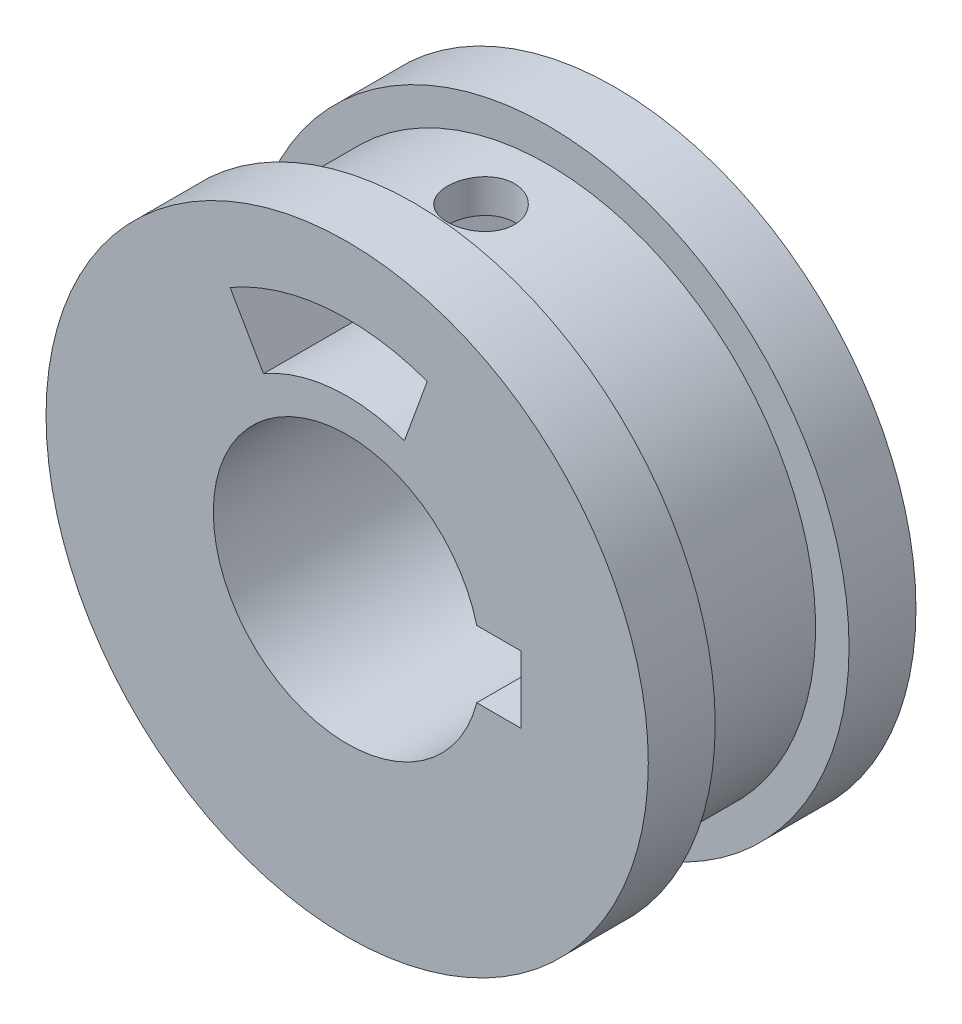
ISO-10303-21;
HEADER;
FILE_DESCRIPTION(('STEP AP214'),'2;1');
FILE_NAME('part.step','',(''),(''),'','','');
FILE_SCHEMA(('AUTOMOTIVE_DESIGN { 1 0 10303 214 1 1 1 1 }'));
ENDSEC;
DATA;
#1=APPLICATION_CONTEXT('core data for automotive mechanical design processes');
#2=APPLICATION_PROTOCOL_DEFINITION('international standard','automotive_design',2000,#1);
#3=PRODUCT_CONTEXT('',#1,'mechanical');
#4=PRODUCT('Part','Part','',(#3));
#5=PRODUCT_RELATED_PRODUCT_CATEGORY('part','',(#4));
#6=PRODUCT_DEFINITION_FORMATION('','',#4);
#7=PRODUCT_DEFINITION_CONTEXT('part definition',#1,'design');
#8=PRODUCT_DEFINITION('design','',#6,#7);
#9=PRODUCT_DEFINITION_SHAPE('','',#8);
#10=(LENGTH_UNIT() NAMED_UNIT(*) SI_UNIT(.MILLI.,.METRE.));
#11=(NAMED_UNIT(*) PLANE_ANGLE_UNIT() SI_UNIT($,.RADIAN.));
#12=(NAMED_UNIT(*) SI_UNIT($,.STERADIAN.) SOLID_ANGLE_UNIT());
#13=UNCERTAINTY_MEASURE_WITH_UNIT(LENGTH_MEASURE(1.E-05),#10,'distance_accuracy_value','');
#14=(GEOMETRIC_REPRESENTATION_CONTEXT(3) GLOBAL_UNCERTAINTY_ASSIGNED_CONTEXT((#13)) GLOBAL_UNIT_ASSIGNED_CONTEXT((#10,
#11,#12)) REPRESENTATION_CONTEXT('',''));
#15=CARTESIAN_POINT('',(0.,0.,0.));
#16=DIRECTION('',(0.,0.,1.));
#17=DIRECTION('',(1.,0.,0.));
#18=AXIS2_PLACEMENT_3D('',#15,#16,#17);
#19=CARTESIAN_POINT('',(0.,0.,5.));
#20=DIRECTION('',(0.,0.,-1.));
#21=DIRECTION('',(-1.,0.,0.));
#22=AXIS2_PLACEMENT_3D('',#19,#20,#21);
#23=PLANE('',#22);
#24=CARTESIAN_POINT('',(0.,0.,5.));
#25=DIRECTION('',(0.,0.,-1.));
#26=DIRECTION('',(-1.,0.,0.));
#27=AXIS2_PLACEMENT_3D('',#24,#25,#26);
#28=CIRCLE('',#27,20.);
#29=CARTESIAN_POINT('',(-20.,0.,5.));
#30=VERTEX_POINT('',#29);
#31=EDGE_CURVE('E20',#30,#30,#28,.F.);
#32=ORIENTED_EDGE('',*,*,#31,.F.);
#33=EDGE_LOOP('',(#32));
#34=FACE_BOUND('',#33,.T.);
#35=CARTESIAN_POINT('',(0.,0.,5.));
#36=DIRECTION('',(0.,0.,-1.));
#37=DIRECTION('',(-1.,0.,0.));
#38=AXIS2_PLACEMENT_3D('',#35,#36,#37);
#39=CIRCLE('',#38,22.5);
#40=CARTESIAN_POINT('',(-22.5,0.,5.));
#41=VERTEX_POINT('',#40);
#42=EDGE_CURVE('E254',#41,#41,#39,.T.);
#43=ORIENTED_EDGE('',*,*,#42,.F.);
#44=EDGE_LOOP('',(#43));
#45=FACE_BOUND('',#44,.T.);
#46=ADVANCED_FACE('F17',(#34,#45),#23,.F.);
#47=CARTESIAN_POINT('',(0.,0.,20.));
#48=DIRECTION('',(0.,0.,-1.));
#49=DIRECTION('',(-1.,0.,0.));
#50=AXIS2_PLACEMENT_3D('',#47,#48,#49);
#51=CYLINDRICAL_SURFACE('',#50,20.);
#52=CARTESIAN_POINT('',(0.,0.,15.));
#53=DIRECTION('',(0.,0.,-1.));
#54=DIRECTION('',(-1.,0.,0.));
#55=AXIS2_PLACEMENT_3D('',#52,#53,#54);
#56=CIRCLE('',#55,20.);
#57=CARTESIAN_POINT('',(-20.,0.,15.));
#58=VERTEX_POINT('',#57);
#59=EDGE_CURVE('E253',#58,#58,#56,.T.);
#60=ORIENTED_EDGE('',*,*,#59,.T.);
#61=EDGE_LOOP('',(#60));
#62=FACE_BOUND('',#61,.T.);
#63=ORIENTED_EDGE('',*,*,#31,.T.);
#64=EDGE_LOOP('',(#63));
#65=FACE_BOUND('',#64,.T.);
#66=CARTESIAN_POINT('',(0.,20.,7.5));
#67=CARTESIAN_POINT('',(0.139713189598048,19.9999980443686,7.50000615442661));
#68=CARTESIAN_POINT('',(0.279609383569895,19.998519409005,7.51176062885172));
#69=CARTESIAN_POINT('',(0.555606454896001,19.9927598254834,7.55849143417192));
#70=CARTESIAN_POINT('',(0.691698827520247,19.9884730515749,7.59351604333119));
#71=CARTESIAN_POINT('',(0.955907860083872,19.9775799462847,7.68574330993618));
#72=CARTESIAN_POINT('',(1.08403287607431,19.9709760950257,7.74292226090798));
#73=CARTESIAN_POINT('',(1.32880908040608,19.9561850070835,7.87778627919372));
#74=CARTESIAN_POINT('',(1.44546501208912,19.9479984291694,7.95546281980596));
#75=CARTESIAN_POINT('',(1.66470977120655,19.930903427743,8.12958976216708));
#76=CARTESIAN_POINT('',(1.7672251671919,19.9219915921268,8.22613230337491));
#77=CARTESIAN_POINT('',(1.95464863382608,19.9044776894708,8.43505721837391));
#78=CARTESIAN_POINT('',(2.03955493014625,19.8958756537193,8.54744118646496));
#79=CARTESIAN_POINT('',(2.1896104723576,19.8799230209184,8.78532050244997));
#80=CARTESIAN_POINT('',(2.2546926608095,19.8725767074735,8.91085846265691));
#81=CARTESIAN_POINT('',(2.36282345905487,19.8600112387492,9.17118823160936));
#82=CARTESIAN_POINT('',(2.40587309667409,19.854791984244,9.30597960834718));
#83=CARTESIAN_POINT('',(2.46849895130874,19.8471033994326,9.58024407562229));
#84=CARTESIAN_POINT('',(2.48819668083506,19.8446198386756,9.71968901395424));
#85=CARTESIAN_POINT('',(2.50393555598909,19.842640280612,9.9999260182341));
#86=CARTESIAN_POINT('',(2.49997761181588,19.8431441683573,10.1407180321425));
#87=CARTESIAN_POINT('',(2.46861730815944,19.8470695450239,10.4188042159096));
#88=CARTESIAN_POINT('',(2.44134901409606,19.8504743494559,10.5561137735925));
#89=CARTESIAN_POINT('',(2.36435081282,19.859791945265,10.8241938637295));
#90=CARTESIAN_POINT('',(2.31462025264028,19.8657048095499,10.9549642059691));
#91=CARTESIAN_POINT('',(2.19396315085396,19.8793914366455,11.2066731019691));
#92=CARTESIAN_POINT('',(2.1229776411285,19.8871703644242,11.3275830968065));
#93=CARTESIAN_POINT('',(1.96187400295138,19.9037078248886,11.5558154267807));
#94=CARTESIAN_POINT('',(1.8717565471446,19.9124663231293,11.6631382394068));
#95=CARTESIAN_POINT('',(1.6742222242621,19.9300490933122,11.861919979235));
#96=CARTESIAN_POINT('',(1.56669307975597,19.938873411427,11.9532673524581));
#97=CARTESIAN_POINT('',(1.33771052635453,19.9555427350665,12.1166760982179));
#98=CARTESIAN_POINT('',(1.21625077861644,19.9633872913515,12.1887286409006));
#99=CARTESIAN_POINT('',(0.962737163908977,19.9772187576829,12.3114948650218));
#100=CARTESIAN_POINT('',(0.830671278624398,19.983203521842,12.3621839204272));
#101=CARTESIAN_POINT('',(0.559989370463855,19.9926149602829,12.4405302280753));
#102=CARTESIAN_POINT('',(0.421387876439091,19.9960470482703,12.4682362371546));
#103=CARTESIAN_POINT('',(0.234863836933905,19.998676210664,12.4893900358281));
#104=CARTESIAN_POINT('',(0.187986351081591,19.9991716246736,12.4933657634558));
#105=CARTESIAN_POINT('',(0.0940794949593464,19.9998338486945,12.4986717823262));
#106=CARTESIAN_POINT('',(0.0470501246325561,20.0000006585828,12.5000020725784));
#107=CARTESIAN_POINT('',(-0.139713189598049,19.9999980443686,12.4999938455734));
#108=CARTESIAN_POINT('',(-0.279609383569895,19.998519409005,12.4882393711483));
#109=CARTESIAN_POINT('',(-0.555606454896002,19.9927598254834,12.4415085658281));
#110=CARTESIAN_POINT('',(-0.691698827520247,19.9884730515749,12.4064839566688));
#111=CARTESIAN_POINT('',(-0.955907860083873,19.9775799462847,12.3142566900638));
#112=CARTESIAN_POINT('',(-1.08403287607431,19.9709760950257,12.257077739092));
#113=CARTESIAN_POINT('',(-1.32880908040608,19.9561850070835,12.1222137208063));
#114=CARTESIAN_POINT('',(-1.44546501208912,19.9479984291694,12.044537180194));
#115=CARTESIAN_POINT('',(-1.66470977120656,19.930903427743,11.8704102378329));
#116=CARTESIAN_POINT('',(-1.7672251671919,19.9219915921268,11.7738676966251));
#117=CARTESIAN_POINT('',(-1.95464863382608,19.9044776894708,11.5649427816261));
#118=CARTESIAN_POINT('',(-2.03955493014625,19.8958756537193,11.452558813535));
#119=CARTESIAN_POINT('',(-2.1896104723576,19.8799230209184,11.21467949755));
#120=CARTESIAN_POINT('',(-2.2546926608095,19.8725767074735,11.0891415373431));
#121=CARTESIAN_POINT('',(-2.36282345905487,19.8600112387492,10.8288117683906));
#122=CARTESIAN_POINT('',(-2.40587309667409,19.854791984244,10.6940203916528));
#123=CARTESIAN_POINT('',(-2.46849895130874,19.8471033994326,10.4197559243777));
#124=CARTESIAN_POINT('',(-2.48819668083506,19.8446198386756,10.2803109860458));
#125=CARTESIAN_POINT('',(-2.50393555598909,19.842640280612,10.0000739817659));
#126=CARTESIAN_POINT('',(-2.49997761181588,19.8431441683573,9.85928196785752));
#127=CARTESIAN_POINT('',(-2.46861730815944,19.8470695450239,9.58119578409042));
#128=CARTESIAN_POINT('',(-2.44134901409606,19.8504743494559,9.44388622640751));
#129=CARTESIAN_POINT('',(-2.36435081282,19.859791945265,9.1758061362705));
#130=CARTESIAN_POINT('',(-2.31462025264028,19.8657048095499,9.04503579403093));
#131=CARTESIAN_POINT('',(-2.19396315085396,19.8793914366455,8.79332689803087));
#132=CARTESIAN_POINT('',(-2.1229776411285,19.8871703644242,8.67241690319351));
#133=CARTESIAN_POINT('',(-1.96187400295138,19.9037078248886,8.44418457321927));
#134=CARTESIAN_POINT('',(-1.8717565471446,19.9124663231293,8.33686176059319));
#135=CARTESIAN_POINT('',(-1.6742222242621,19.9300490933122,8.13808002076496));
#136=CARTESIAN_POINT('',(-1.56669307975597,19.938873411427,8.0467326475419));
#137=CARTESIAN_POINT('',(-1.33771052635452,19.9555427350665,7.88332390178214));
#138=CARTESIAN_POINT('',(-1.21625077861644,19.9633872913515,7.81127135909941));
#139=CARTESIAN_POINT('',(-0.962737163908976,19.9772187576829,7.68850513497819));
#140=CARTESIAN_POINT('',(-0.830671278624397,19.983203521842,7.63781607957281));
#141=CARTESIAN_POINT('',(-0.559989370463854,19.9926149602829,7.55946977192473));
#142=CARTESIAN_POINT('',(-0.421387876439089,19.9960470482703,7.53176376284543));
#143=CARTESIAN_POINT('',(-0.234863836933904,19.998676210664,7.5106099641719));
#144=CARTESIAN_POINT('',(-0.18798635108159,19.9991716246736,7.50663423654419));
#145=CARTESIAN_POINT('',(-0.094079494959346,19.9998338486945,7.50132821767381));
#146=CARTESIAN_POINT('',(-0.0470501246325562,20.0000006585828,7.4999979274216));
#147=CARTESIAN_POINT('',(0.,20.,7.5));
#148=B_SPLINE_CURVE_WITH_KNOTS('',3,(#66,#67,#68,#69,#70,#71,#72,#73,#74,#75,#76,#77,#78,#79,
#80,#81,#82,#83,#84,#85,#86,#87,#88,#89,#90,#91,#92,#93,#94,#95,#96,#97,#98,#99,#100,#101,#102,
#103,#104,#105,#106,#107,#108,#109,#110,#111,#112,#113,#114,#115,#116,#117,#118,#119,#120,#121,
#122,#123,#124,#125,#126,#127,#128,#129,#130,#131,#132,#133,#134,#135,#136,#137,#138,#139,#140,
#141,#142,#143,#144,#145,#146,#147),.UNSPECIFIED.,.T.,.F.,(4,2,2,2,2,2,2,2,2,2,2,2,2,2,2,2,2,2,
2,2,2,2,2,2,2,2,2,2,2,2,2,2,2,2,2,2,2,2,2,2,4),(0.,0.418960261796394,0.838792460972906,
1.25817664973857,1.67738665499378,2.09869765024113,2.52005107703733,2.94281434746063,
3.3655578940399,3.78609188636704,4.20660969791665,4.62472512174395,5.04285270076334,
5.46215122207473,5.88143500404375,6.30353884756742,6.72583552878007,7.1486176754829,
7.57050061060488,7.71159054785433,7.85268053792843,8.27164079972482,8.69147299890133,
9.110857187667,9.53006719292221,9.95137818816956,10.3727316149658,10.7954948853891,
11.2182384319683,11.6387724242955,12.0592902358451,12.4774056596724,12.8955332386918,
13.3148317600032,13.7341155419722,14.1562193854958,14.5785160667085,15.0012982134113,
15.4231811485333,15.5642710857828,15.7053610758569),.UNSPECIFIED.);
#149=CARTESIAN_POINT('',(0.,20.,7.5));
#150=VERTEX_POINT('',#149);
#151=EDGE_CURVE('E251',#150,#150,#148,.T.);
#152=ORIENTED_EDGE('',*,*,#151,.T.);
#153=EDGE_LOOP('',(#152));
#154=FACE_BOUND('',#153,.T.);
#155=ADVANCED_FACE('F261',(#62,#65,#154),#51,.T.);
#156=CARTESIAN_POINT('',(0.,0.,5.));
#157=DIRECTION('',(0.,0.,-1.));
#158=DIRECTION('',(-1.,0.,0.));
#159=AXIS2_PLACEMENT_3D('',#156,#157,#158);
#160=CYLINDRICAL_SURFACE('',#159,22.5);
#161=CARTESIAN_POINT('',(0.,0.,0.));
#162=DIRECTION('',(0.,0.,-1.));
#163=DIRECTION('',(-1.,0.,0.));
#164=AXIS2_PLACEMENT_3D('',#161,#162,#163);
#165=CIRCLE('',#164,22.5);
#166=CARTESIAN_POINT('',(-22.5,0.,0.));
#167=VERTEX_POINT('',#166);
#168=EDGE_CURVE('E125',#167,#167,#165,.F.);
#169=ORIENTED_EDGE('',*,*,#168,.T.);
#170=EDGE_LOOP('',(#169));
#171=FACE_BOUND('',#170,.T.);
#172=ORIENTED_EDGE('',*,*,#42,.T.);
#173=EDGE_LOOP('',(#172));
#174=FACE_BOUND('',#173,.T.);
#175=ADVANCED_FACE('F179',(#171,#174),#160,.T.);
#176=CARTESIAN_POINT('',(0.,15.,10.));
#177=DIRECTION('',(0.,1.,0.));
#178=DIRECTION('',(0.,0.,1.));
#179=AXIS2_PLACEMENT_3D('',#176,#177,#178);
#180=CYLINDRICAL_SURFACE('',#179,2.5);
#181=CARTESIAN_POINT('',(0.,17.5,7.5));
#182=CARTESIAN_POINT('',(0.139532158386026,17.4999977491633,7.50000625871697));
#183=CARTESIAN_POINT('',(0.279245222286515,17.4983123159995,7.51173050648568));
#184=CARTESIAN_POINT('',(0.554871799110362,17.4917469737289,7.55833551719998));
#185=CARTESIAN_POINT('',(0.690776883673537,17.4868604850354,7.59326397717084));
#186=CARTESIAN_POINT('',(0.95460923335205,17.4744424734234,7.68522095026607));
#187=CARTESIAN_POINT('',(1.08254539186004,17.4669139636391,7.74222429537546));
#188=CARTESIAN_POINT('',(1.32697937807906,17.450047392765,7.87665822384406));
#189=CARTESIAN_POINT('',(1.44348174013705,17.4407100534146,7.95408066423772));
#190=CARTESIAN_POINT('',(1.66264352846061,17.4211887267662,8.12775821120435));
#191=CARTESIAN_POINT('',(1.76520869447854,17.4109996610593,8.22413171452862));
#192=CARTESIAN_POINT('',(1.95277400084706,17.3909629948656,8.4327253513901));
#193=CARTESIAN_POINT('',(2.03777227896958,17.3811154306725,8.54494716285198));
#194=CARTESIAN_POINT('',(2.18814000179851,17.3628288718517,8.78266331405635));
#195=CARTESIAN_POINT('',(2.2534208790338,17.3543963063094,8.90821421481416));
#196=CARTESIAN_POINT('',(2.36193401266882,17.3399620138196,9.16863752674741));
#197=CARTESIAN_POINT('',(2.40516755046367,17.3339601456035,9.30350939566912));
#198=CARTESIAN_POINT('',(2.46807327177081,17.3251154882505,9.57777490677273));
#199=CARTESIAN_POINT('',(2.48790368777158,17.3222514929734,9.71713156043767));
#200=CARTESIAN_POINT('',(2.50393025625377,17.3199423452576,9.9972220226888));
#201=CARTESIAN_POINT('',(2.50012760114123,17.32049702033,10.1379557614365));
#202=CARTESIAN_POINT('',(2.46912552140262,17.3249431347292,10.4156907701137));
#203=CARTESIAN_POINT('',(2.44210194675581,17.3288094942598,10.5527121283628));
#204=CARTESIAN_POINT('',(2.36569972265139,17.3394042343482,10.8202565922395));
#205=CARTESIAN_POINT('',(2.31632030332842,17.3461327134678,10.950779473908));
#206=CARTESIAN_POINT('',(2.19642145192943,17.3617217544375,11.2021631892549));
#207=CARTESIAN_POINT('',(2.12582625369271,17.3705899348666,11.3229873938693));
#208=CARTESIAN_POINT('',(1.9655598168424,17.3894526435054,11.5511316053706));
#209=CARTESIAN_POINT('',(1.87588895637768,17.3994471493855,11.6584518798875));
#210=CARTESIAN_POINT('',(1.67906641608928,17.4195461257129,11.8575535006791));
#211=CARTESIAN_POINT('',(1.57176668291534,17.4296507849824,11.9491885142951));
#212=CARTESIAN_POINT('',(1.34317550341553,17.4487538807636,12.1132137367352));
#213=CARTESIAN_POINT('',(1.22187774752374,17.4577518146176,12.1855952181244));
#214=CARTESIAN_POINT('',(0.968579274488473,17.4736366212586,12.309056948966));
#215=CARTESIAN_POINT('',(0.83656467751723,17.4805206993193,12.3601090307058));
#216=CARTESIAN_POINT('',(0.565892402621145,17.4913696484766,12.4391736629103));
#217=CARTESIAN_POINT('',(0.427249426175988,17.4953406873109,12.4672349063779));
#218=CARTESIAN_POINT('',(0.239695795856718,17.4984241551993,12.4889480291734));
#219=CARTESIAN_POINT('',(0.191858277241915,17.4990138745903,12.4930893052465));
#220=CARTESIAN_POINT('',(0.0960209816066579,17.4998021844189,12.498616368401));
#221=CARTESIAN_POINT('',(0.0480212044984494,17.500000774645,12.5000021539918));
#222=CARTESIAN_POINT('',(-0.139532158386025,17.4999977491633,12.499993741283));
#223=CARTESIAN_POINT('',(-0.279245222286514,17.4983123159995,12.4882694935143));
#224=CARTESIAN_POINT('',(-0.554871799110362,17.4917469737289,12.4416644828));
#225=CARTESIAN_POINT('',(-0.690776883673536,17.4868604850354,12.4067360228292));
#226=CARTESIAN_POINT('',(-0.954609233352049,17.4744424734234,12.3147790497339));
#227=CARTESIAN_POINT('',(-1.08254539186004,17.4669139636391,12.2577757046245));
#228=CARTESIAN_POINT('',(-1.32697937807906,17.450047392765,12.1233417761559));
#229=CARTESIAN_POINT('',(-1.44348174013705,17.4407100534146,12.0459193357623));
#230=CARTESIAN_POINT('',(-1.66264352846061,17.4211887267662,11.8722417887956));
#231=CARTESIAN_POINT('',(-1.76520869447854,17.4109996610593,11.7758682854714));
#232=CARTESIAN_POINT('',(-1.95277400084706,17.3909629948656,11.5672746486099));
#233=CARTESIAN_POINT('',(-2.03777227896958,17.3811154306725,11.455052837148));
#234=CARTESIAN_POINT('',(-2.18814000179851,17.3628288718517,11.2173366859437));
#235=CARTESIAN_POINT('',(-2.2534208790338,17.3543963063094,11.0917857851858));
#236=CARTESIAN_POINT('',(-2.36193401266882,17.3399620138196,10.8313624732526));
#237=CARTESIAN_POINT('',(-2.40516755046367,17.3339601456035,10.6964906043309));
#238=CARTESIAN_POINT('',(-2.46807327177081,17.3251154882505,10.4222250932273));
#239=CARTESIAN_POINT('',(-2.48790368777158,17.3222514929734,10.2828684395623));
#240=CARTESIAN_POINT('',(-2.50393025625377,17.3199423452576,10.0027779773112));
#241=CARTESIAN_POINT('',(-2.50012760114123,17.32049702033,9.86204423856352));
#242=CARTESIAN_POINT('',(-2.46912552140262,17.3249431347292,9.58430922988629));
#243=CARTESIAN_POINT('',(-2.44210194675581,17.3288094942598,9.44728787163717));
#244=CARTESIAN_POINT('',(-2.36569972265139,17.3394042343482,9.1797434077605));
#245=CARTESIAN_POINT('',(-2.31632030332842,17.3461327134678,9.04922052609198));
#246=CARTESIAN_POINT('',(-2.19642145192943,17.3617217544375,8.79783681074506));
#247=CARTESIAN_POINT('',(-2.12582625369271,17.3705899348666,8.67701260613071));
#248=CARTESIAN_POINT('',(-1.9655598168424,17.3894526435054,8.44886839462936));
#249=CARTESIAN_POINT('',(-1.87588895637768,17.3994471493855,8.34154812011254));
#250=CARTESIAN_POINT('',(-1.67906641608928,17.4195461257129,8.14244649932089));
#251=CARTESIAN_POINT('',(-1.57176668291534,17.4296507849824,8.05081148570491));
#252=CARTESIAN_POINT('',(-1.34317550341553,17.4487538807636,7.88678626326482));
#253=CARTESIAN_POINT('',(-1.22187774752374,17.4577518146176,7.81440478187559));
#254=CARTESIAN_POINT('',(-0.968579274488472,17.4736366212586,7.690943051034));
#255=CARTESIAN_POINT('',(-0.836564677517229,17.4805206993193,7.63989096929417));
#256=CARTESIAN_POINT('',(-0.565892402621144,17.4913696484766,7.56082633708965));
#257=CARTESIAN_POINT('',(-0.427249426175986,17.4953406873109,7.53276509362209));
#258=CARTESIAN_POINT('',(-0.239695795856717,17.4984241551993,7.51105197082663));
#259=CARTESIAN_POINT('',(-0.191858277241915,17.4990138745903,7.50691069475347));
#260=CARTESIAN_POINT('',(-0.0960209816066574,17.4998021844189,7.50138363159901));
#261=CARTESIAN_POINT('',(-0.0480212044984485,17.500000774645,7.49999784600818));
#262=CARTESIAN_POINT('',(0.,17.5,7.5));
#263=B_SPLINE_CURVE_WITH_KNOTS('',3,(#181,#182,#183,#184,#185,#186,#187,#188,#189,#190,#191,
#192,#193,#194,#195,#196,#197,#198,#199,#200,#201,#202,#203,#204,#205,#206,#207,#208,#209,#210,
#211,#212,#213,#214,#215,#216,#217,#218,#219,#220,#221,#222,#223,#224,#225,#226,#227,#228,#229,
#230,#231,#232,#233,#234,#235,#236,#237,#238,#239,#240,#241,#242,#243,#244,#245,#246,#247,#248,
#249,#250,#251,#252,#253,#254,#255,#256,#257,#258,#259,#260,#261,#262),.UNSPECIFIED.,.T.,.F.,(4,
2,2,2,2,2,2,2,2,2,2,2,2,2,2,2,2,2,2,2,2,2,2,2,2,2,2,2,2,2,2,2,2,2,2,2,2,2,2,2,4),(0.,
0.418413353080385,0.837689440828001,1.25648890428976,1.67512160588318,2.09645793970327,
2.51783891560003,2.94108544434453,3.36430737112467,3.78465112355586,4.20497366772526,
4.62214091988036,5.03932253906354,5.45801207541049,5.87669331258401,6.29908966221665,
6.72167715489234,7.14482096809688,7.56706625831302,7.71106677086295,7.85506736130438,
8.27348071438477,8.69275680213238,9.11155626559415,9.53018896718756,9.95152530100766,
10.3729062769044,10.7961528056489,11.2193747324291,11.6397184848602,12.0600410290296,
12.4772082811847,12.8943899003679,13.3130794367149,13.7317606738884,14.154157023521,
14.5767445161967,14.9998883294013,15.4221336196174,15.5661341321673,15.7101347226088),.UNSPECIFIED.);
#264=CARTESIAN_POINT('',(0.,17.5,7.5));
#265=VERTEX_POINT('',#264);
#266=EDGE_CURVE('E94',#265,#265,#263,.T.);
#267=ORIENTED_EDGE('',*,*,#266,.T.);
#268=EDGE_LOOP('',(#267));
#269=FACE_BOUND('',#268,.T.);
#270=ORIENTED_EDGE('',*,*,#151,.F.);
#271=EDGE_LOOP('',(#270));
#272=FACE_BOUND('',#271,.T.);
#273=ADVANCED_FACE('F151',(#269,#272),#180,.F.);
#274=CARTESIAN_POINT('',(0.,0.,15.));
#275=DIRECTION('',(0.,0.,1.));
#276=DIRECTION('',(1.,0.,0.));
#277=AXIS2_PLACEMENT_3D('',#274,#275,#276);
#278=PLANE('',#277);
#279=ORIENTED_EDGE('',*,*,#59,.F.);
#280=EDGE_LOOP('',(#279));
#281=FACE_BOUND('',#280,.T.);
#282=CARTESIAN_POINT('',(0.,0.,15.));
#283=DIRECTION('',(0.,0.,1.));
#284=DIRECTION('',(1.,0.,0.));
#285=AXIS2_PLACEMENT_3D('',#282,#283,#284);
#286=CIRCLE('',#285,22.5);
#287=CARTESIAN_POINT('',(22.5,0.,15.));
#288=VERTEX_POINT('',#287);
#289=EDGE_CURVE('E115',#288,#288,#286,.T.);
#290=ORIENTED_EDGE('',*,*,#289,.F.);
#291=EDGE_LOOP('',(#290));
#292=FACE_BOUND('',#291,.T.);
#293=ADVANCED_FACE('F171',(#281,#292),#278,.F.);
#294=CARTESIAN_POINT('',(0.,0.,0.));
#295=DIRECTION('',(0.,0.,1.));
#296=DIRECTION('',(1.,0.,0.));
#297=AXIS2_PLACEMENT_3D('',#294,#295,#296);
#298=PLANE('',#297);
#299=DIRECTION('',(0.,1.,0.));
#300=VECTOR('',#299,1.);
#301=CARTESIAN_POINT('',(13.,0.,0.));
#302=LINE('',#301,#300);
#303=CARTESIAN_POINT('',(13.,2.5,0.));
#304=VERTEX_POINT('',#303);
#305=CARTESIAN_POINT('',(13.,-2.5,0.));
#306=VERTEX_POINT('',#305);
#307=EDGE_CURVE('E111',#304,#306,#302,.F.);
#308=ORIENTED_EDGE('',*,*,#307,.F.);
#309=DIRECTION('',(-1.,0.,0.));
#310=VECTOR('',#309,1.);
#311=CARTESIAN_POINT('',(0.,2.5,0.));
#312=LINE('',#311,#310);
#313=CARTESIAN_POINT('',(9.68245836551854,2.5,0.));
#314=VERTEX_POINT('',#313);
#315=EDGE_CURVE('E106',#304,#314,#312,.T.);
#316=ORIENTED_EDGE('',*,*,#315,.T.);
#317=CARTESIAN_POINT('',(0.,0.,0.));
#318=DIRECTION('',(0.,0.,1.));
#319=DIRECTION('',(1.,0.,0.));
#320=AXIS2_PLACEMENT_3D('',#317,#318,#319);
#321=CIRCLE('',#320,10.);
#322=CARTESIAN_POINT('',(9.68245836551854,-2.5,0.));
#323=VERTEX_POINT('',#322);
#324=EDGE_CURVE('E121',#314,#323,#321,.T.);
#325=ORIENTED_EDGE('',*,*,#324,.T.);
#326=DIRECTION('',(-1.,0.,0.));
#327=VECTOR('',#326,1.);
#328=CARTESIAN_POINT('',(0.,-2.5,0.));
#329=LINE('',#328,#327);
#330=EDGE_CURVE('E118',#306,#323,#329,.T.);
#331=ORIENTED_EDGE('',*,*,#330,.F.);
#332=EDGE_LOOP('',(#308,#316,#325,#331));
#333=FACE_BOUND('',#332,.T.);
#334=ORIENTED_EDGE('',*,*,#168,.F.);
#335=EDGE_LOOP('',(#334));
#336=FACE_BOUND('',#335,.T.);
#337=DIRECTION('',(0.342020143325679,0.939692620785905,0.));
#338=VECTOR('',#337,1.);
#339=CARTESIAN_POINT('',(0.,0.,0.));
#340=LINE('',#339,#338);
#341=CARTESIAN_POINT('',(4.27525179157099,11.7461577598238,0.));
#342=VERTEX_POINT('',#341);
#343=CARTESIAN_POINT('',(5.98535250819939,16.4446208637533,0.));
#344=VERTEX_POINT('',#343);
#345=EDGE_CURVE('E72',#342,#344,#340,.T.);
#346=ORIENTED_EDGE('',*,*,#345,.T.);
#347=CARTESIAN_POINT('',(0.,0.,0.));
#348=DIRECTION('',(0.,0.,1.));
#349=DIRECTION('',(1.,0.,0.));
#350=AXIS2_PLACEMENT_3D('',#347,#348,#349);
#351=CIRCLE('',#350,17.5);
#352=CARTESIAN_POINT('',(-8.74999999999986,15.1554445662278,0.));
#353=VERTEX_POINT('',#352);
#354=EDGE_CURVE('E91',#344,#353,#351,.T.);
#355=ORIENTED_EDGE('',*,*,#354,.T.);
#356=DIRECTION('',(-0.499999999999992,0.866025403784443,0.));
#357=VECTOR('',#356,1.);
#358=CARTESIAN_POINT('',(0.,0.,0.));
#359=LINE('',#358,#357);
#360=CARTESIAN_POINT('',(-6.2499999999999,10.8253175473055,0.));
#361=VERTEX_POINT('',#360);
#362=EDGE_CURVE('E88',#361,#353,#359,.T.);
#363=ORIENTED_EDGE('',*,*,#362,.F.);
#364=CARTESIAN_POINT('',(0.,0.,0.));
#365=DIRECTION('',(0.,0.,1.));
#366=DIRECTION('',(1.,0.,0.));
#367=AXIS2_PLACEMENT_3D('',#364,#365,#366);
#368=CIRCLE('',#367,12.5);
#369=EDGE_CURVE('E77',#342,#361,#368,.T.);
#370=ORIENTED_EDGE('',*,*,#369,.F.);
#371=EDGE_LOOP('',(#346,#355,#363,#370));
#372=FACE_BOUND('',#371,.T.);
#373=ADVANCED_FACE('F89',(#333,#336,#372),#298,.F.);
#374=CARTESIAN_POINT('',(0.,0.,0.));
#375=DIRECTION('',(0.939692620785905,-0.342020143325679,0.));
#376=DIRECTION('',(0.342020143325679,0.939692620785905,0.));
#377=AXIS2_PLACEMENT_3D('',#374,#375,#376);
#378=PLANE('',#377);
#379=DIRECTION('',(0.,0.,1.));
#380=VECTOR('',#379,1.);
#381=CARTESIAN_POINT('',(5.98535250819939,16.4446208637533,0.));
#382=LINE('',#381,#380);
#383=CARTESIAN_POINT('',(5.98535250819939,16.4446208637533,20.));
#384=VERTEX_POINT('',#383);
#385=EDGE_CURVE('E103',#384,#344,#382,.F.);
#386=ORIENTED_EDGE('',*,*,#385,.T.);
#387=ORIENTED_EDGE('',*,*,#345,.F.);
#388=DIRECTION('',(0.,0.,1.));
#389=VECTOR('',#388,1.);
#390=CARTESIAN_POINT('',(4.27525179157099,11.7461577598238,0.));
#391=LINE('',#390,#389);
#392=CARTESIAN_POINT('',(4.27525179157099,11.7461577598238,20.));
#393=VERTEX_POINT('',#392);
#394=EDGE_CURVE('E84',#393,#342,#391,.F.);
#395=ORIENTED_EDGE('',*,*,#394,.F.);
#396=DIRECTION('',(-0.342020143325679,-0.939692620785904,0.));
#397=VECTOR('',#396,1.);
#398=CARTESIAN_POINT('',(5.98535250819939,16.4446208637533,20.));
#399=LINE('',#398,#397);
#400=EDGE_CURVE('E138',#384,#393,#399,.T.);
#401=ORIENTED_EDGE('',*,*,#400,.F.);
#402=EDGE_LOOP('',(#386,#387,#395,#401));
#403=FACE_BOUND('',#402,.T.);
#404=ADVANCED_FACE('F167',(#403),#378,.F.);
#405=CARTESIAN_POINT('',(0.,0.,0.));
#406=DIRECTION('',(0.,0.,1.));
#407=DIRECTION('',(1.,0.,0.));
#408=AXIS2_PLACEMENT_3D('',#405,#406,#407);
#409=CYLINDRICAL_SURFACE('',#408,12.5);
#410=ORIENTED_EDGE('',*,*,#369,.T.);
#411=DIRECTION('',(0.,0.,1.));
#412=VECTOR('',#411,1.);
#413=CARTESIAN_POINT('',(-6.2499999999999,10.8253175473055,0.));
#414=LINE('',#413,#412);
#415=CARTESIAN_POINT('',(-6.2499999999999,10.8253175473055,20.));
#416=VERTEX_POINT('',#415);
#417=EDGE_CURVE('E82',#416,#361,#414,.F.);
#418=ORIENTED_EDGE('',*,*,#417,.F.);
#419=CARTESIAN_POINT('',(0.,0.,20.));
#420=DIRECTION('',(0.,0.,1.));
#421=DIRECTION('',(1.,0.,0.));
#422=AXIS2_PLACEMENT_3D('',#419,#420,#421);
#423=CIRCLE('',#422,12.5);
#424=EDGE_CURVE('E136',#393,#416,#423,.T.);
#425=ORIENTED_EDGE('',*,*,#424,.F.);
#426=ORIENTED_EDGE('',*,*,#394,.T.);
#427=EDGE_LOOP('',(#410,#418,#425,#426));
#428=FACE_BOUND('',#427,.T.);
#429=ADVANCED_FACE('F79',(#428),#409,.T.);
#430=CARTESIAN_POINT('',(0.,0.,0.));
#431=DIRECTION('',(0.866025403784443,0.499999999999992,0.));
#432=DIRECTION('',(-0.499999999999992,0.866025403784443,0.));
#433=AXIS2_PLACEMENT_3D('',#430,#431,#432);
#434=PLANE('',#433);
#435=ORIENTED_EDGE('',*,*,#362,.T.);
#436=DIRECTION('',(0.,0.,1.));
#437=VECTOR('',#436,1.);
#438=CARTESIAN_POINT('',(-8.74999999999986,15.1554445662278,0.));
#439=LINE('',#438,#437);
#440=CARTESIAN_POINT('',(-8.74999999999986,15.1554445662278,20.));
#441=VERTEX_POINT('',#440);
#442=EDGE_CURVE('E143',#353,#441,#439,.T.);
#443=ORIENTED_EDGE('',*,*,#442,.T.);
#444=DIRECTION('',(-0.499999999999992,0.866025403784443,0.));
#445=VECTOR('',#444,1.);
#446=CARTESIAN_POINT('',(-6.2499999999999,10.8253175473055,20.));
#447=LINE('',#446,#445);
#448=EDGE_CURVE('E98',#416,#441,#447,.T.);
#449=ORIENTED_EDGE('',*,*,#448,.F.);
#450=ORIENTED_EDGE('',*,*,#417,.T.);
#451=EDGE_LOOP('',(#435,#443,#449,#450));
#452=FACE_BOUND('',#451,.T.);
#453=ADVANCED_FACE('F96',(#452),#434,.T.);
#454=CARTESIAN_POINT('',(0.,0.,0.));
#455=DIRECTION('',(0.,0.,1.));
#456=DIRECTION('',(1.,0.,0.));
#457=AXIS2_PLACEMENT_3D('',#454,#455,#456);
#458=CYLINDRICAL_SURFACE('',#457,17.5);
#459=ORIENTED_EDGE('',*,*,#442,.F.);
#460=ORIENTED_EDGE('',*,*,#354,.F.);
#461=ORIENTED_EDGE('',*,*,#385,.F.);
#462=CARTESIAN_POINT('',(0.,0.,20.));
#463=DIRECTION('',(0.,0.,1.));
#464=DIRECTION('',(1.,0.,0.));
#465=AXIS2_PLACEMENT_3D('',#462,#463,#464);
#466=CIRCLE('',#465,17.5);
#467=EDGE_CURVE('E133',#441,#384,#466,.F.);
#468=ORIENTED_EDGE('',*,*,#467,.F.);
#469=EDGE_LOOP('',(#459,#460,#461,#468));
#470=FACE_BOUND('',#469,.T.);
#471=ORIENTED_EDGE('',*,*,#266,.F.);
#472=EDGE_LOOP('',(#471));
#473=FACE_BOUND('',#472,.T.);
#474=ADVANCED_FACE('F155',(#470,#473),#458,.F.);
#475=CARTESIAN_POINT('',(0.,0.,15.));
#476=DIRECTION('',(0.,0.,1.));
#477=DIRECTION('',(1.,0.,0.));
#478=AXIS2_PLACEMENT_3D('',#475,#476,#477);
#479=CYLINDRICAL_SURFACE('',#478,22.5);
#480=ORIENTED_EDGE('',*,*,#289,.T.);
#481=EDGE_LOOP('',(#480));
#482=FACE_BOUND('',#481,.T.);
#483=CARTESIAN_POINT('',(0.,0.,20.));
#484=DIRECTION('',(0.,0.,1.));
#485=DIRECTION('',(1.,0.,0.));
#486=AXIS2_PLACEMENT_3D('',#483,#484,#485);
#487=CIRCLE('',#486,22.5);
#488=CARTESIAN_POINT('',(22.5,0.,20.));
#489=VERTEX_POINT('',#488);
#490=EDGE_CURVE('E129',#489,#489,#487,.T.);
#491=ORIENTED_EDGE('',*,*,#490,.F.);
#492=EDGE_LOOP('',(#491));
#493=FACE_BOUND('',#492,.T.);
#494=ADVANCED_FACE('F160',(#482,#493),#479,.T.);
#495=CARTESIAN_POINT('',(13.,0.,0.));
#496=DIRECTION('',(-1.,0.,0.));
#497=DIRECTION('',(0.,0.,1.));
#498=AXIS2_PLACEMENT_3D('',#495,#496,#497);
#499=PLANE('',#498);
#500=ORIENTED_EDGE('',*,*,#307,.T.);
#501=DIRECTION('',(0.,0.,1.));
#502=VECTOR('',#501,1.);
#503=CARTESIAN_POINT('',(13.,-2.5,0.));
#504=LINE('',#503,#502);
#505=CARTESIAN_POINT('',(13.,-2.5,20.));
#506=VERTEX_POINT('',#505);
#507=EDGE_CURVE('E114',#506,#306,#504,.F.);
#508=ORIENTED_EDGE('',*,*,#507,.F.);
#509=DIRECTION('',(0.,1.,0.));
#510=VECTOR('',#509,1.);
#511=CARTESIAN_POINT('',(13.,0.,20.));
#512=LINE('',#511,#510);
#513=CARTESIAN_POINT('',(13.,2.5,20.));
#514=VERTEX_POINT('',#513);
#515=EDGE_CURVE('E132',#514,#506,#512,.F.);
#516=ORIENTED_EDGE('',*,*,#515,.F.);
#517=DIRECTION('',(0.,0.,1.));
#518=VECTOR('',#517,1.);
#519=CARTESIAN_POINT('',(13.,2.5,0.));
#520=LINE('',#519,#518);
#521=EDGE_CURVE('E108',#514,#304,#520,.F.);
#522=ORIENTED_EDGE('',*,*,#521,.T.);
#523=EDGE_LOOP('',(#500,#508,#516,#522));
#524=FACE_BOUND('',#523,.T.);
#525=ADVANCED_FACE('F200',(#524),#499,.T.);
#526=CARTESIAN_POINT('',(0.,-2.5,0.));
#527=DIRECTION('',(0.,1.,0.));
#528=DIRECTION('',(-1.,0.,0.));
#529=AXIS2_PLACEMENT_3D('',#526,#527,#528);
#530=PLANE('',#529);
#531=ORIENTED_EDGE('',*,*,#330,.T.);
#532=DIRECTION('',(0.,0.,1.));
#533=VECTOR('',#532,1.);
#534=CARTESIAN_POINT('',(9.68245836551854,-2.5,0.));
#535=LINE('',#534,#533);
#536=CARTESIAN_POINT('',(9.68245836551854,-2.5,20.));
#537=VERTEX_POINT('',#536);
#538=EDGE_CURVE('E140',#323,#537,#535,.T.);
#539=ORIENTED_EDGE('',*,*,#538,.T.);
#540=DIRECTION('',(1.,0.,0.));
#541=VECTOR('',#540,1.);
#542=CARTESIAN_POINT('',(0.,-2.5,20.));
#543=LINE('',#542,#541);
#544=EDGE_CURVE('E128',#506,#537,#543,.F.);
#545=ORIENTED_EDGE('',*,*,#544,.F.);
#546=ORIENTED_EDGE('',*,*,#507,.T.);
#547=EDGE_LOOP('',(#531,#539,#545,#546));
#548=FACE_BOUND('',#547,.T.);
#549=ADVANCED_FACE('F198',(#548),#530,.T.);
#550=CARTESIAN_POINT('',(0.,0.,0.));
#551=DIRECTION('',(0.,0.,1.));
#552=DIRECTION('',(1.,0.,0.));
#553=AXIS2_PLACEMENT_3D('',#550,#551,#552);
#554=CYLINDRICAL_SURFACE('',#553,10.);
#555=ORIENTED_EDGE('',*,*,#324,.F.);
#556=DIRECTION('',(0.,0.,1.));
#557=VECTOR('',#556,1.);
#558=CARTESIAN_POINT('',(9.68245836551854,2.5,0.));
#559=LINE('',#558,#557);
#560=CARTESIAN_POINT('',(9.68245836551854,2.5,20.));
#561=VERTEX_POINT('',#560);
#562=EDGE_CURVE('E35',#314,#561,#559,.T.);
#563=ORIENTED_EDGE('',*,*,#562,.T.);
#564=CARTESIAN_POINT('',(0.,0.,20.));
#565=DIRECTION('',(0.,0.,1.));
#566=DIRECTION('',(1.,0.,0.));
#567=AXIS2_PLACEMENT_3D('',#564,#565,#566);
#568=CIRCLE('',#567,10.);
#569=EDGE_CURVE('E26',#537,#561,#568,.F.);
#570=ORIENTED_EDGE('',*,*,#569,.F.);
#571=ORIENTED_EDGE('',*,*,#538,.F.);
#572=EDGE_LOOP('',(#555,#563,#570,#571));
#573=FACE_BOUND('',#572,.T.);
#574=ADVANCED_FACE('F191',(#573),#554,.F.);
#575=CARTESIAN_POINT('',(0.,2.5,0.));
#576=DIRECTION('',(0.,1.,0.));
#577=DIRECTION('',(-1.,0.,0.));
#578=AXIS2_PLACEMENT_3D('',#575,#576,#577);
#579=PLANE('',#578);
#580=ORIENTED_EDGE('',*,*,#562,.F.);
#581=ORIENTED_EDGE('',*,*,#315,.F.);
#582=ORIENTED_EDGE('',*,*,#521,.F.);
#583=DIRECTION('',(1.,0.,0.));
#584=VECTOR('',#583,1.);
#585=CARTESIAN_POINT('',(0.,2.5,20.));
#586=LINE('',#585,#584);
#587=EDGE_CURVE('E11',#561,#514,#586,.T.);
#588=ORIENTED_EDGE('',*,*,#587,.F.);
#589=EDGE_LOOP('',(#580,#581,#582,#588));
#590=FACE_BOUND('',#589,.T.);
#591=ADVANCED_FACE('F185',(#590),#579,.F.);
#592=CARTESIAN_POINT('',(0.,0.,20.));
#593=DIRECTION('',(0.,0.,1.));
#594=DIRECTION('',(1.,0.,0.));
#595=AXIS2_PLACEMENT_3D('',#592,#593,#594);
#596=PLANE('',#595);
#597=ORIENTED_EDGE('',*,*,#569,.T.);
#598=ORIENTED_EDGE('',*,*,#587,.T.);
#599=ORIENTED_EDGE('',*,*,#515,.T.);
#600=ORIENTED_EDGE('',*,*,#544,.T.);
#601=EDGE_LOOP('',(#597,#598,#599,#600));
#602=FACE_BOUND('',#601,.T.);
#603=ORIENTED_EDGE('',*,*,#490,.T.);
#604=EDGE_LOOP('',(#603));
#605=FACE_BOUND('',#604,.T.);
#606=ORIENTED_EDGE('',*,*,#448,.T.);
#607=ORIENTED_EDGE('',*,*,#467,.T.);
#608=ORIENTED_EDGE('',*,*,#400,.T.);
#609=ORIENTED_EDGE('',*,*,#424,.T.);
#610=EDGE_LOOP('',(#606,#607,#608,#609));
#611=FACE_BOUND('',#610,.T.);
#612=ADVANCED_FACE('F183',(#602,#605,#611),#596,.T.);
#613=CLOSED_SHELL('',(#46,#155,#175,#273,#293,#373,#404,#429,#453,#474,#494,#525,#549,#574,#591,#612));
#614=MANIFOLD_SOLID_BREP('B1',#613);
#615=ADVANCED_BREP_SHAPE_REPRESENTATION('',(#18,#614),#14);
#616=SHAPE_DEFINITION_REPRESENTATION(#9,#615);
ENDSEC;
END-ISO-10303-21;
